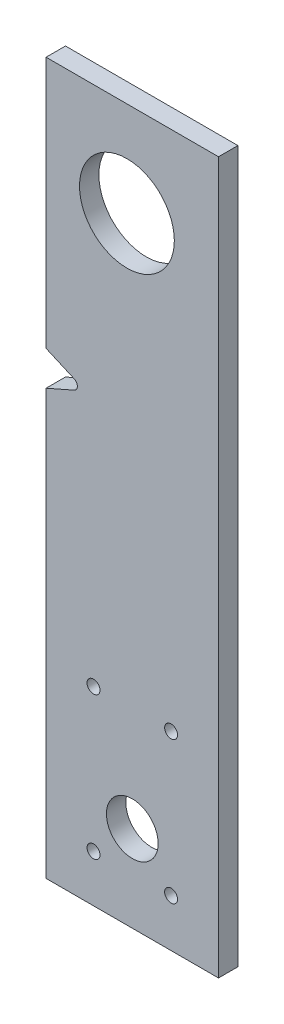
ISO-10303-21;
HEADER;
FILE_DESCRIPTION(('STEP AP214'),'2;1');
FILE_NAME('part.step','',(''),(''),'','','');
FILE_SCHEMA(('AUTOMOTIVE_DESIGN { 1 0 10303 214 1 1 1 1 }'));
ENDSEC;
DATA;
#1=APPLICATION_CONTEXT('core data for automotive mechanical design processes');
#2=APPLICATION_PROTOCOL_DEFINITION('international standard','automotive_design',2000,#1);
#3=PRODUCT_CONTEXT('',#1,'mechanical');
#4=PRODUCT('Part','Part','',(#3));
#5=PRODUCT_RELATED_PRODUCT_CATEGORY('part','',(#4));
#6=PRODUCT_DEFINITION_FORMATION('','',#4);
#7=PRODUCT_DEFINITION_CONTEXT('part definition',#1,'design');
#8=PRODUCT_DEFINITION('design','',#6,#7);
#9=PRODUCT_DEFINITION_SHAPE('','',#8);
#10=(LENGTH_UNIT() NAMED_UNIT(*) SI_UNIT(.MILLI.,.METRE.));
#11=(NAMED_UNIT(*) PLANE_ANGLE_UNIT() SI_UNIT($,.RADIAN.));
#12=(NAMED_UNIT(*) SI_UNIT($,.STERADIAN.) SOLID_ANGLE_UNIT());
#13=UNCERTAINTY_MEASURE_WITH_UNIT(LENGTH_MEASURE(1.E-05),#10,'distance_accuracy_value','');
#14=(GEOMETRIC_REPRESENTATION_CONTEXT(3) GLOBAL_UNCERTAINTY_ASSIGNED_CONTEXT((#13)) GLOBAL_UNIT_ASSIGNED_CONTEXT((#10,
#11,#12)) REPRESENTATION_CONTEXT('',''));
#15=CARTESIAN_POINT('',(0.,0.,0.));
#16=DIRECTION('',(0.,0.,1.));
#17=DIRECTION('',(1.,0.,0.));
#18=AXIS2_PLACEMENT_3D('',#15,#16,#17);
#19=CARTESIAN_POINT('',(-18.75,-20.,-7.75));
#20=DIRECTION('',(1.,0.,0.));
#21=DIRECTION('',(0.,0.,-1.));
#22=AXIS2_PLACEMENT_3D('',#19,#20,#21);
#23=PLANE('',#22);
#24=DIRECTION('',(0.,1.,0.));
#25=VECTOR('',#24,1.);
#26=CARTESIAN_POINT('',(-18.75,-20.,2.25));
#27=LINE('',#26,#25);
#28=CARTESIAN_POINT('',(-18.75,-20.,2.25));
#29=VERTEX_POINT('',#28);
#30=CARTESIAN_POINT('',(-18.75,78.5,2.25));
#31=VERTEX_POINT('',#30);
#32=EDGE_CURVE('E122',#29,#31,#27,.T.);
#33=ORIENTED_EDGE('',*,*,#32,.T.);
#34=DIRECTION('',(0.,0.,-1.));
#35=VECTOR('',#34,1.);
#36=CARTESIAN_POINT('',(-18.75,78.5,-7.75));
#37=LINE('',#36,#35);
#38=CARTESIAN_POINT('',(-18.75,78.5,-2.25));
#39=VERTEX_POINT('',#38);
#40=EDGE_CURVE('E11',#31,#39,#37,.T.);
#41=ORIENTED_EDGE('',*,*,#40,.T.);
#42=DIRECTION('',(0.,1.,0.));
#43=VECTOR('',#42,1.);
#44=CARTESIAN_POINT('',(-18.75,0.,-2.25));
#45=LINE('',#44,#43);
#46=CARTESIAN_POINT('',(-18.75,-20.,-2.25));
#47=VERTEX_POINT('',#46);
#48=EDGE_CURVE('E120',#47,#39,#45,.T.);
#49=ORIENTED_EDGE('',*,*,#48,.F.);
#50=DIRECTION('',(0.,0.,1.));
#51=VECTOR('',#50,1.);
#52=CARTESIAN_POINT('',(-18.75,-20.,-7.75));
#53=LINE('',#52,#51);
#54=EDGE_CURVE('E136',#47,#29,#53,.T.);
#55=ORIENTED_EDGE('',*,*,#54,.T.);
#56=EDGE_LOOP('',(#33,#41,#49,#55));
#57=FACE_BOUND('',#56,.T.);
#58=ADVANCED_FACE('F39',(#57),#23,.F.);
#59=CARTESIAN_POINT('',(21.25,20.,2.25));
#60=DIRECTION('',(-1.,0.,0.));
#61=DIRECTION('',(0.,0.,1.));
#62=AXIS2_PLACEMENT_3D('',#59,#60,#61);
#63=PLANE('',#62);
#64=DIRECTION('',(0.,1.,0.));
#65=VECTOR('',#64,1.);
#66=CARTESIAN_POINT('',(21.25,20.,-2.25));
#67=LINE('',#66,#65);
#68=CARTESIAN_POINT('',(21.25,-20.,-2.25));
#69=VERTEX_POINT('',#68);
#70=CARTESIAN_POINT('',(21.25,145.,-2.25));
#71=VERTEX_POINT('',#70);
#72=EDGE_CURVE('E156',#69,#71,#67,.T.);
#73=ORIENTED_EDGE('',*,*,#72,.T.);
#74=DIRECTION('',(0.,0.,-1.));
#75=VECTOR('',#74,1.);
#76=CARTESIAN_POINT('',(21.25,145.,-2.25));
#77=LINE('',#76,#75);
#78=CARTESIAN_POINT('',(21.25,145.,2.25));
#79=VERTEX_POINT('',#78);
#80=EDGE_CURVE('E209',#79,#71,#77,.T.);
#81=ORIENTED_EDGE('',*,*,#80,.F.);
#82=DIRECTION('',(0.,1.,0.));
#83=VECTOR('',#82,1.);
#84=CARTESIAN_POINT('',(21.25,20.,2.25));
#85=LINE('',#84,#83);
#86=CARTESIAN_POINT('',(21.25,-20.,2.25));
#87=VERTEX_POINT('',#86);
#88=EDGE_CURVE('E158',#87,#79,#85,.T.);
#89=ORIENTED_EDGE('',*,*,#88,.F.);
#90=DIRECTION('',(0.,0.,-1.));
#91=VECTOR('',#90,1.);
#92=CARTESIAN_POINT('',(21.25,-20.,2.25));
#93=LINE('',#92,#91);
#94=EDGE_CURVE('E163',#87,#69,#93,.T.);
#95=ORIENTED_EDGE('',*,*,#94,.T.);
#96=EDGE_LOOP('',(#73,#81,#89,#95));
#97=FACE_BOUND('',#96,.T.);
#98=ADVANCED_FACE('F41',(#97),#63,.F.);
#99=CARTESIAN_POINT('',(-21.25,-20.,2.25));
#100=DIRECTION('',(0.,1.,0.));
#101=DIRECTION('',(0.,0.,1.));
#102=AXIS2_PLACEMENT_3D('',#99,#100,#101);
#103=PLANE('',#102);
#104=DIRECTION('',(1.,0.,0.));
#105=VECTOR('',#104,1.);
#106=CARTESIAN_POINT('',(-21.25,-20.,2.25));
#107=LINE('',#106,#105);
#108=EDGE_CURVE('E64',#29,#87,#107,.T.);
#109=ORIENTED_EDGE('',*,*,#108,.F.);
#110=ORIENTED_EDGE('',*,*,#54,.F.);
#111=DIRECTION('',(1.,0.,0.));
#112=VECTOR('',#111,1.);
#113=CARTESIAN_POINT('',(-21.25,-20.,-2.25));
#114=LINE('',#113,#112);
#115=EDGE_CURVE('E126',#47,#69,#114,.T.);
#116=ORIENTED_EDGE('',*,*,#115,.T.);
#117=ORIENTED_EDGE('',*,*,#94,.F.);
#118=EDGE_LOOP('',(#109,#110,#116,#117));
#119=FACE_BOUND('',#118,.T.);
#120=ADVANCED_FACE('F249',(#119),#103,.F.);
#121=CARTESIAN_POINT('',(0.,0.,2.25));
#122=DIRECTION('',(0.,0.,1.));
#123=DIRECTION('',(1.,0.,0.));
#124=AXIS2_PLACEMENT_3D('',#121,#122,#123);
#125=PLANE('',#124);
#126=DIRECTION('',(0.915608041038949,0.402072027359301,0.));
#127=VECTOR('',#126,1.);
#128=CARTESIAN_POINT('',(-31.9301808438855,72.7121718078732,2.25));
#129=LINE('',#128,#127);
#130=CARTESIAN_POINT('',(-12.2474099658009,81.3554899487013,2.25));
#131=VERTEX_POINT('',#130);
#132=EDGE_CURVE('E231',#31,#131,#129,.T.);
#133=ORIENTED_EDGE('',*,*,#132,.F.);
#134=ORIENTED_EDGE('',*,*,#32,.F.);
#135=ORIENTED_EDGE('',*,*,#108,.T.);
#136=ORIENTED_EDGE('',*,*,#88,.T.);
#137=DIRECTION('',(1.,0.,0.));
#138=VECTOR('',#137,1.);
#139=CARTESIAN_POINT('',(-18.75,145.,2.25));
#140=LINE('',#139,#138);
#141=CARTESIAN_POINT('',(-18.75,145.,2.25));
#142=VERTEX_POINT('',#141);
#143=EDGE_CURVE('E202',#142,#79,#140,.T.);
#144=ORIENTED_EDGE('',*,*,#143,.F.);
#145=CARTESIAN_POINT('',(-18.75,86.5,2.25));
#146=VERTEX_POINT('',#145);
#147=EDGE_CURVE('E194',#146,#142,#27,.T.);
#148=ORIENTED_EDGE('',*,*,#147,.F.);
#149=DIRECTION('',(-0.915608041038949,0.402072027359301,0.));
#150=VECTOR('',#149,1.);
#151=CARTESIAN_POINT('',(28.8129820750709,65.6136121866318,2.25));
#152=LINE('',#151,#150);
#153=CARTESIAN_POINT('',(-12.2474099658009,83.6445100512987,2.25));
#154=VERTEX_POINT('',#153);
#155=EDGE_CURVE('E55',#154,#146,#152,.T.);
#156=ORIENTED_EDGE('',*,*,#155,.F.);
#157=CARTESIAN_POINT('',(-12.75,82.5,2.25));
#158=DIRECTION('',(0.,0.,1.));
#159=DIRECTION('',(1.,0.,0.));
#160=AXIS2_PLACEMENT_3D('',#157,#158,#159);
#161=CIRCLE('',#160,1.25);
#162=EDGE_CURVE('E228',#131,#154,#161,.T.);
#163=ORIENTED_EDGE('',*,*,#162,.F.);
#164=EDGE_LOOP('',(#133,#134,#135,#136,#144,#148,#156,#163));
#165=FACE_BOUND('',#164,.T.);
#166=CARTESIAN_POINT('',(0.,123.,2.25));
#167=DIRECTION('',(0.,0.,1.));
#168=DIRECTION('',(1.,0.,0.));
#169=AXIS2_PLACEMENT_3D('',#166,#167,#168);
#170=CIRCLE('',#169,11.);
#171=CARTESIAN_POINT('',(11.,123.,2.25));
#172=VERTEX_POINT('',#171);
#173=EDGE_CURVE('E220',#172,#172,#170,.T.);
#174=ORIENTED_EDGE('',*,*,#173,.F.);
#175=EDGE_LOOP('',(#174));
#176=FACE_BOUND('',#175,.T.);
#177=CARTESIAN_POINT('',(-7.75,-9.0539033957695,2.25));
#178=DIRECTION('',(0.,0.,1.));
#179=DIRECTION('',(1.,0.,0.));
#180=AXIS2_PLACEMENT_3D('',#177,#178,#179);
#181=CIRCLE('',#180,1.5);
#182=CARTESIAN_POINT('',(-6.25,-9.0539033957695,2.25));
#183=VERTEX_POINT('',#182);
#184=EDGE_CURVE('E128',#183,#183,#181,.T.);
#185=ORIENTED_EDGE('',*,*,#184,.F.);
#186=EDGE_LOOP('',(#185));
#187=FACE_BOUND('',#186,.T.);
#188=CARTESIAN_POINT('',(10.25,-8.94577181131251,2.25));
#189=DIRECTION('',(0.,0.,1.));
#190=DIRECTION('',(1.,0.,0.));
#191=AXIS2_PLACEMENT_3D('',#188,#189,#190);
#192=CIRCLE('',#191,1.5);
#193=CARTESIAN_POINT('',(11.75,-8.94577181131251,2.25));
#194=VERTEX_POINT('',#193);
#195=EDGE_CURVE('E134',#194,#194,#192,.T.);
#196=ORIENTED_EDGE('',*,*,#195,.F.);
#197=EDGE_LOOP('',(#196));
#198=FACE_BOUND('',#197,.T.);
#199=CARTESIAN_POINT('',(10.25,24.0536327350045,2.25));
#200=DIRECTION('',(0.,0.,1.));
#201=DIRECTION('',(1.,0.,0.));
#202=AXIS2_PLACEMENT_3D('',#199,#200,#201);
#203=CIRCLE('',#202,1.5);
#204=CARTESIAN_POINT('',(11.75,24.0536327350045,2.25));
#205=VERTEX_POINT('',#204);
#206=EDGE_CURVE('E140',#205,#205,#203,.T.);
#207=ORIENTED_EDGE('',*,*,#206,.F.);
#208=EDGE_LOOP('',(#207));
#209=FACE_BOUND('',#208,.T.);
#210=CARTESIAN_POINT('',(-7.75,24.0536327350045,2.25));
#211=DIRECTION('',(0.,0.,1.));
#212=DIRECTION('',(1.,0.,0.));
#213=AXIS2_PLACEMENT_3D('',#210,#211,#212);
#214=CIRCLE('',#213,1.5);
#215=CARTESIAN_POINT('',(-6.25,24.0536327350045,2.25));
#216=VERTEX_POINT('',#215);
#217=EDGE_CURVE('E144',#216,#216,#214,.T.);
#218=ORIENTED_EDGE('',*,*,#217,.F.);
#219=EDGE_LOOP('',(#218));
#220=FACE_BOUND('',#219,.T.);
#221=CARTESIAN_POINT('',(1.25,0.,2.25));
#222=DIRECTION('',(0.,0.,1.));
#223=DIRECTION('',(1.,0.,0.));
#224=AXIS2_PLACEMENT_3D('',#221,#222,#223);
#225=CIRCLE('',#224,6.);
#226=CARTESIAN_POINT('',(7.25,0.,2.25));
#227=VERTEX_POINT('',#226);
#228=EDGE_CURVE('E152',#227,#227,#225,.T.);
#229=ORIENTED_EDGE('',*,*,#228,.F.);
#230=EDGE_LOOP('',(#229));
#231=FACE_BOUND('',#230,.T.);
#232=ADVANCED_FACE('F198',(#165,#176,#187,#198,#209,#220,#231),#125,.T.);
#233=CARTESIAN_POINT('',(0.,0.,-2.25));
#234=DIRECTION('',(0.,0.,1.));
#235=DIRECTION('',(1.,0.,0.));
#236=AXIS2_PLACEMENT_3D('',#233,#234,#235);
#237=PLANE('',#236);
#238=CARTESIAN_POINT('',(0.,123.,-2.25));
#239=DIRECTION('',(0.,0.,-1.));
#240=DIRECTION('',(-1.,0.,0.));
#241=AXIS2_PLACEMENT_3D('',#238,#239,#240);
#242=CIRCLE('',#241,11.);
#243=CARTESIAN_POINT('',(-11.,123.,-2.25));
#244=VERTEX_POINT('',#243);
#245=EDGE_CURVE('E224',#244,#244,#242,.T.);
#246=ORIENTED_EDGE('',*,*,#245,.F.);
#247=EDGE_LOOP('',(#246));
#248=FACE_BOUND('',#247,.T.);
#249=CARTESIAN_POINT('',(-7.75,-9.0539033957695,-2.25));
#250=DIRECTION('',(0.,0.,1.));
#251=DIRECTION('',(1.,0.,0.));
#252=AXIS2_PLACEMENT_3D('',#249,#250,#251);
#253=CIRCLE('',#252,1.5);
#254=CARTESIAN_POINT('',(-6.25,-9.0539033957695,-2.25));
#255=VERTEX_POINT('',#254);
#256=EDGE_CURVE('E174',#255,#255,#253,.T.);
#257=ORIENTED_EDGE('',*,*,#256,.T.);
#258=EDGE_LOOP('',(#257));
#259=FACE_BOUND('',#258,.T.);
#260=CARTESIAN_POINT('',(10.25,-8.94577181131251,-2.25));
#261=DIRECTION('',(0.,0.,1.));
#262=DIRECTION('',(1.,0.,0.));
#263=AXIS2_PLACEMENT_3D('',#260,#261,#262);
#264=CIRCLE('',#263,1.5);
#265=CARTESIAN_POINT('',(11.75,-8.94577181131251,-2.25));
#266=VERTEX_POINT('',#265);
#267=EDGE_CURVE('E182',#266,#266,#264,.T.);
#268=ORIENTED_EDGE('',*,*,#267,.T.);
#269=EDGE_LOOP('',(#268));
#270=FACE_BOUND('',#269,.T.);
#271=CARTESIAN_POINT('',(10.25,24.0536327350045,-2.25));
#272=DIRECTION('',(0.,0.,1.));
#273=DIRECTION('',(1.,0.,0.));
#274=AXIS2_PLACEMENT_3D('',#271,#272,#273);
#275=CIRCLE('',#274,1.5);
#276=CARTESIAN_POINT('',(11.75,24.0536327350045,-2.25));
#277=VERTEX_POINT('',#276);
#278=EDGE_CURVE('E178',#277,#277,#275,.T.);
#279=ORIENTED_EDGE('',*,*,#278,.T.);
#280=EDGE_LOOP('',(#279));
#281=FACE_BOUND('',#280,.T.);
#282=CARTESIAN_POINT('',(-7.75,24.0536327350045,-2.25));
#283=DIRECTION('',(0.,0.,1.));
#284=DIRECTION('',(1.,0.,0.));
#285=AXIS2_PLACEMENT_3D('',#282,#283,#284);
#286=CIRCLE('',#285,1.5);
#287=CARTESIAN_POINT('',(-6.25,24.0536327350045,-2.25));
#288=VERTEX_POINT('',#287);
#289=EDGE_CURVE('E151',#288,#288,#286,.T.);
#290=ORIENTED_EDGE('',*,*,#289,.T.);
#291=EDGE_LOOP('',(#290));
#292=FACE_BOUND('',#291,.T.);
#293=CARTESIAN_POINT('',(1.25,0.,-2.25));
#294=DIRECTION('',(0.,0.,1.));
#295=DIRECTION('',(1.,0.,0.));
#296=AXIS2_PLACEMENT_3D('',#293,#294,#295);
#297=CIRCLE('',#296,6.);
#298=CARTESIAN_POINT('',(7.25,0.,-2.25));
#299=VERTEX_POINT('',#298);
#300=EDGE_CURVE('E157',#299,#299,#297,.T.);
#301=ORIENTED_EDGE('',*,*,#300,.T.);
#302=EDGE_LOOP('',(#301));
#303=FACE_BOUND('',#302,.T.);
#304=ORIENTED_EDGE('',*,*,#48,.T.);
#305=DIRECTION('',(-0.915608041038949,-0.402072027359301,0.));
#306=VECTOR('',#305,1.);
#307=CARTESIAN_POINT('',(-31.9301808438855,72.7121718078732,-2.25));
#308=LINE('',#307,#306);
#309=CARTESIAN_POINT('',(-12.2474099658009,81.3554899487013,-2.25));
#310=VERTEX_POINT('',#309);
#311=EDGE_CURVE('E106',#310,#39,#308,.T.);
#312=ORIENTED_EDGE('',*,*,#311,.F.);
#313=CARTESIAN_POINT('',(-12.75,82.5,-2.25));
#314=DIRECTION('',(0.,0.,-1.));
#315=DIRECTION('',(-1.,0.,0.));
#316=AXIS2_PLACEMENT_3D('',#313,#314,#315);
#317=CIRCLE('',#316,1.25);
#318=CARTESIAN_POINT('',(-12.2474099658009,83.6445100512987,-2.25));
#319=VERTEX_POINT('',#318);
#320=EDGE_CURVE('E239',#319,#310,#317,.T.);
#321=ORIENTED_EDGE('',*,*,#320,.F.);
#322=DIRECTION('',(0.915608041038949,-0.402072027359301,0.));
#323=VECTOR('',#322,1.);
#324=CARTESIAN_POINT('',(28.8129820750709,65.6136121866318,-2.25));
#325=LINE('',#324,#323);
#326=CARTESIAN_POINT('',(-18.75,86.5,-2.25));
#327=VERTEX_POINT('',#326);
#328=EDGE_CURVE('E116',#327,#319,#325,.T.);
#329=ORIENTED_EDGE('',*,*,#328,.F.);
#330=CARTESIAN_POINT('',(-18.75,145.,-2.25));
#331=VERTEX_POINT('',#330);
#332=EDGE_CURVE('E129',#327,#331,#45,.T.);
#333=ORIENTED_EDGE('',*,*,#332,.T.);
#334=DIRECTION('',(-1.,0.,0.));
#335=VECTOR('',#334,1.);
#336=CARTESIAN_POINT('',(-18.75,145.,-2.25));
#337=LINE('',#336,#335);
#338=EDGE_CURVE('E205',#71,#331,#337,.T.);
#339=ORIENTED_EDGE('',*,*,#338,.F.);
#340=ORIENTED_EDGE('',*,*,#72,.F.);
#341=ORIENTED_EDGE('',*,*,#115,.F.);
#342=EDGE_LOOP('',(#304,#312,#321,#329,#333,#339,#340,#341));
#343=FACE_BOUND('',#342,.T.);
#344=ADVANCED_FACE('F124',(#248,#259,#270,#281,#292,#303,#343),#237,.F.);
#345=CARTESIAN_POINT('',(1.25,0.,-2.75));
#346=DIRECTION('',(0.,0.,1.));
#347=DIRECTION('',(1.,0.,0.));
#348=AXIS2_PLACEMENT_3D('',#345,#346,#347);
#349=CYLINDRICAL_SURFACE('',#348,6.);
#350=ORIENTED_EDGE('',*,*,#228,.T.);
#351=EDGE_LOOP('',(#350));
#352=FACE_BOUND('',#351,.T.);
#353=ORIENTED_EDGE('',*,*,#300,.F.);
#354=EDGE_LOOP('',(#353));
#355=FACE_BOUND('',#354,.T.);
#356=ADVANCED_FACE('F286',(#352,#355),#349,.F.);
#357=CARTESIAN_POINT('',(-7.75,24.0536327350045,-7.75));
#358=DIRECTION('',(0.,0.,1.));
#359=DIRECTION('',(1.,0.,0.));
#360=AXIS2_PLACEMENT_3D('',#357,#358,#359);
#361=CYLINDRICAL_SURFACE('',#360,1.5);
#362=ORIENTED_EDGE('',*,*,#217,.T.);
#363=EDGE_LOOP('',(#362));
#364=FACE_BOUND('',#363,.T.);
#365=ORIENTED_EDGE('',*,*,#289,.F.);
#366=EDGE_LOOP('',(#365));
#367=FACE_BOUND('',#366,.T.);
#368=ADVANCED_FACE('F276',(#364,#367),#361,.F.);
#369=CARTESIAN_POINT('',(10.25,24.0536327350045,-7.75));
#370=DIRECTION('',(0.,0.,1.));
#371=DIRECTION('',(1.,0.,0.));
#372=AXIS2_PLACEMENT_3D('',#369,#370,#371);
#373=CYLINDRICAL_SURFACE('',#372,1.5);
#374=ORIENTED_EDGE('',*,*,#206,.T.);
#375=EDGE_LOOP('',(#374));
#376=FACE_BOUND('',#375,.T.);
#377=ORIENTED_EDGE('',*,*,#278,.F.);
#378=EDGE_LOOP('',(#377));
#379=FACE_BOUND('',#378,.T.);
#380=ADVANCED_FACE('F272',(#376,#379),#373,.F.);
#381=CARTESIAN_POINT('',(10.25,-8.94577181131251,-7.75));
#382=DIRECTION('',(0.,0.,1.));
#383=DIRECTION('',(1.,0.,0.));
#384=AXIS2_PLACEMENT_3D('',#381,#382,#383);
#385=CYLINDRICAL_SURFACE('',#384,1.5);
#386=ORIENTED_EDGE('',*,*,#195,.T.);
#387=EDGE_LOOP('',(#386));
#388=FACE_BOUND('',#387,.T.);
#389=ORIENTED_EDGE('',*,*,#267,.F.);
#390=EDGE_LOOP('',(#389));
#391=FACE_BOUND('',#390,.T.);
#392=ADVANCED_FACE('F275',(#388,#391),#385,.F.);
#393=CARTESIAN_POINT('',(-7.75,-9.0539033957695,-7.75));
#394=DIRECTION('',(0.,0.,1.));
#395=DIRECTION('',(1.,0.,0.));
#396=AXIS2_PLACEMENT_3D('',#393,#394,#395);
#397=CYLINDRICAL_SURFACE('',#396,1.5);
#398=ORIENTED_EDGE('',*,*,#184,.T.);
#399=EDGE_LOOP('',(#398));
#400=FACE_BOUND('',#399,.T.);
#401=ORIENTED_EDGE('',*,*,#256,.F.);
#402=EDGE_LOOP('',(#401));
#403=FACE_BOUND('',#402,.T.);
#404=ADVANCED_FACE('F265',(#400,#403),#397,.F.);
#405=ORIENTED_EDGE('',*,*,#332,.F.);
#406=DIRECTION('',(0.,0.,1.));
#407=VECTOR('',#406,1.);
#408=CARTESIAN_POINT('',(-18.75,86.5,-7.75));
#409=LINE('',#408,#407);
#410=EDGE_CURVE('E48',#327,#146,#409,.T.);
#411=ORIENTED_EDGE('',*,*,#410,.T.);
#412=ORIENTED_EDGE('',*,*,#147,.T.);
#413=DIRECTION('',(0.,0.,1.));
#414=VECTOR('',#413,1.);
#415=CARTESIAN_POINT('',(-18.75,145.,-2.25));
#416=LINE('',#415,#414);
#417=EDGE_CURVE('E217',#331,#142,#416,.T.);
#418=ORIENTED_EDGE('',*,*,#417,.F.);
#419=EDGE_LOOP('',(#405,#411,#412,#418));
#420=FACE_BOUND('',#419,.T.);
#421=ADVANCED_FACE('F192',(#420),#23,.F.);
#422=CARTESIAN_POINT('',(0.,145.,0.));
#423=DIRECTION('',(0.,1.,0.));
#424=DIRECTION('',(0.,0.,1.));
#425=AXIS2_PLACEMENT_3D('',#422,#423,#424);
#426=PLANE('',#425);
#427=ORIENTED_EDGE('',*,*,#417,.T.);
#428=ORIENTED_EDGE('',*,*,#143,.T.);
#429=ORIENTED_EDGE('',*,*,#80,.T.);
#430=ORIENTED_EDGE('',*,*,#338,.T.);
#431=EDGE_LOOP('',(#427,#428,#429,#430));
#432=FACE_BOUND('',#431,.T.);
#433=ADVANCED_FACE('F254',(#432),#426,.T.);
#434=CARTESIAN_POINT('',(0.,123.,97.75));
#435=DIRECTION('',(0.,0.,-1.));
#436=DIRECTION('',(-1.,0.,0.));
#437=AXIS2_PLACEMENT_3D('',#434,#435,#436);
#438=CYLINDRICAL_SURFACE('',#437,11.);
#439=ORIENTED_EDGE('',*,*,#173,.T.);
#440=EDGE_LOOP('',(#439));
#441=FACE_BOUND('',#440,.T.);
#442=ORIENTED_EDGE('',*,*,#245,.T.);
#443=EDGE_LOOP('',(#442));
#444=FACE_BOUND('',#443,.T.);
#445=ADVANCED_FACE('F257',(#441,#444),#438,.F.);
#446=CARTESIAN_POINT('',(-31.9301808438855,72.7121718078732,97.75));
#447=DIRECTION('',(0.402072027359301,-0.915608041038949,0.));
#448=DIRECTION('',(0.915608041038949,0.402072027359301,0.));
#449=AXIS2_PLACEMENT_3D('',#446,#447,#448);
#450=PLANE('',#449);
#451=ORIENTED_EDGE('',*,*,#132,.T.);
#452=DIRECTION('',(0.,0.,-1.));
#453=VECTOR('',#452,1.);
#454=CARTESIAN_POINT('',(-12.2474099658009,81.3554899487013,97.75));
#455=LINE('',#454,#453);
#456=EDGE_CURVE('E110',#131,#310,#455,.T.);
#457=ORIENTED_EDGE('',*,*,#456,.T.);
#458=ORIENTED_EDGE('',*,*,#311,.T.);
#459=ORIENTED_EDGE('',*,*,#40,.F.);
#460=EDGE_LOOP('',(#451,#457,#458,#459));
#461=FACE_BOUND('',#460,.T.);
#462=ADVANCED_FACE('F107',(#461),#450,.F.);
#463=CARTESIAN_POINT('',(-12.75,82.5,97.75));
#464=DIRECTION('',(0.,0.,-1.));
#465=DIRECTION('',(-1.,0.,0.));
#466=AXIS2_PLACEMENT_3D('',#463,#464,#465);
#467=CYLINDRICAL_SURFACE('',#466,1.25);
#468=ORIENTED_EDGE('',*,*,#162,.T.);
#469=DIRECTION('',(0.,0.,-1.));
#470=VECTOR('',#469,1.);
#471=CARTESIAN_POINT('',(-12.2474099658009,83.6445100512987,97.75));
#472=LINE('',#471,#470);
#473=EDGE_CURVE('E236',#154,#319,#472,.T.);
#474=ORIENTED_EDGE('',*,*,#473,.T.);
#475=ORIENTED_EDGE('',*,*,#320,.T.);
#476=ORIENTED_EDGE('',*,*,#456,.F.);
#477=EDGE_LOOP('',(#468,#474,#475,#476));
#478=FACE_BOUND('',#477,.T.);
#479=ADVANCED_FACE('F247',(#478),#467,.F.);
#480=CARTESIAN_POINT('',(28.8129820750709,65.6136121866318,97.75));
#481=DIRECTION('',(0.402072027359301,0.915608041038949,0.));
#482=DIRECTION('',(-0.915608041038949,0.402072027359301,0.));
#483=AXIS2_PLACEMENT_3D('',#480,#481,#482);
#484=PLANE('',#483);
#485=ORIENTED_EDGE('',*,*,#155,.T.);
#486=ORIENTED_EDGE('',*,*,#410,.F.);
#487=ORIENTED_EDGE('',*,*,#328,.T.);
#488=ORIENTED_EDGE('',*,*,#473,.F.);
#489=EDGE_LOOP('',(#485,#486,#487,#488));
#490=FACE_BOUND('',#489,.T.);
#491=ADVANCED_FACE('F245',(#490),#484,.F.);
#492=CLOSED_SHELL('',(#58,#98,#120,#232,#344,#356,#368,#380,#392,#404,#421,#433,#445,#462,#479,#491));
#493=MANIFOLD_SOLID_BREP('B2',#492);
#494=ADVANCED_BREP_SHAPE_REPRESENTATION('',(#18,#493),#14);
#495=SHAPE_DEFINITION_REPRESENTATION(#9,#494);
ENDSEC;
END-ISO-10303-21;
